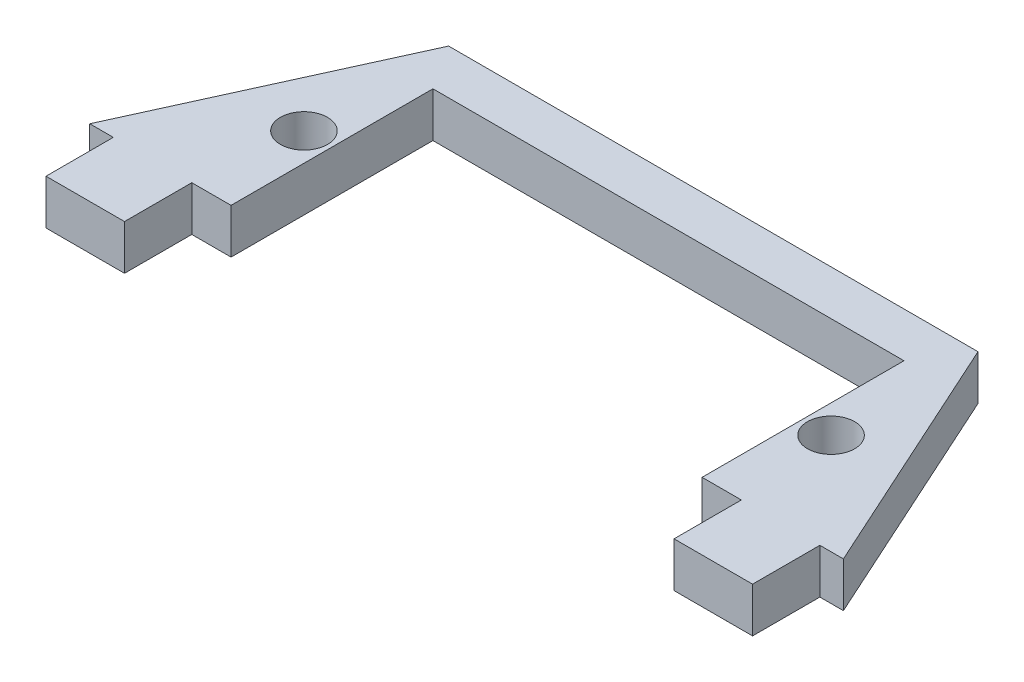
ISO-10303-21;
HEADER;
FILE_DESCRIPTION(('STEP AP214'),'2;1');
FILE_NAME('part.step','',(''),(''),'','','');
FILE_SCHEMA(('AUTOMOTIVE_DESIGN { 1 0 10303 214 1 1 1 1 }'));
ENDSEC;
DATA;
#1=APPLICATION_CONTEXT('core data for automotive mechanical design processes');
#2=APPLICATION_PROTOCOL_DEFINITION('international standard','automotive_design',2000,#1);
#3=PRODUCT_CONTEXT('',#1,'mechanical');
#4=PRODUCT('Part','Part','',(#3));
#5=PRODUCT_RELATED_PRODUCT_CATEGORY('part','',(#4));
#6=PRODUCT_DEFINITION_FORMATION('','',#4);
#7=PRODUCT_DEFINITION_CONTEXT('part definition',#1,'design');
#8=PRODUCT_DEFINITION('design','',#6,#7);
#9=PRODUCT_DEFINITION_SHAPE('','',#8);
#10=(LENGTH_UNIT() NAMED_UNIT(*) SI_UNIT(.MILLI.,.METRE.));
#11=(NAMED_UNIT(*) PLANE_ANGLE_UNIT() SI_UNIT($,.RADIAN.));
#12=(NAMED_UNIT(*) SI_UNIT($,.STERADIAN.) SOLID_ANGLE_UNIT());
#13=UNCERTAINTY_MEASURE_WITH_UNIT(LENGTH_MEASURE(1.E-05),#10,'distance_accuracy_value','');
#14=(GEOMETRIC_REPRESENTATION_CONTEXT(3) GLOBAL_UNCERTAINTY_ASSIGNED_CONTEXT((#13)) GLOBAL_UNIT_ASSIGNED_CONTEXT((#10,
#11,#12)) REPRESENTATION_CONTEXT('',''));
#15=CARTESIAN_POINT('',(0.,0.,0.));
#16=DIRECTION('',(0.,0.,1.));
#17=DIRECTION('',(1.,0.,0.));
#18=AXIS2_PLACEMENT_3D('',#15,#16,#17);
#19=CARTESIAN_POINT('',(0.,2.,1.78664387251308E-12));
#20=DIRECTION('',(1.06388671114322E-13,0.,1.));
#21=DIRECTION('',(1.,0.,-1.06388671114322E-13));
#22=AXIS2_PLACEMENT_3D('',#19,#20,#21);
#23=PLANE('',#22);
#24=DIRECTION('',(-1.,0.,1.06388671114322E-13));
#25=VECTOR('',#24,1.);
#26=CARTESIAN_POINT('',(0.,0.,1.78664387251308E-12));
#27=LINE('',#26,#25);
#28=CARTESIAN_POINT('',(16.8,0.,0.));
#29=VERTEX_POINT('',#28);
#30=CARTESIAN_POINT('',(15.75,0.,1.11022302462516E-13));
#31=VERTEX_POINT('',#30);
#32=EDGE_CURVE('E181',#29,#31,#27,.T.);
#33=ORIENTED_EDGE('',*,*,#32,.F.);
#34=DIRECTION('',(0.,-1.,0.));
#35=VECTOR('',#34,1.);
#36=CARTESIAN_POINT('',(16.8,2.,0.));
#37=LINE('',#36,#35);
#38=CARTESIAN_POINT('',(16.8,2.,0.));
#39=VERTEX_POINT('',#38);
#40=EDGE_CURVE('E11',#39,#29,#37,.T.);
#41=ORIENTED_EDGE('',*,*,#40,.F.);
#42=DIRECTION('',(-1.,0.,1.06388671114322E-13));
#43=VECTOR('',#42,1.);
#44=CARTESIAN_POINT('',(0.,2.,1.78664387251308E-12));
#45=LINE('',#44,#43);
#46=CARTESIAN_POINT('',(15.75,2.,1.11022302462516E-13));
#47=VERTEX_POINT('',#46);
#48=EDGE_CURVE('E223',#39,#47,#45,.T.);
#49=ORIENTED_EDGE('',*,*,#48,.T.);
#50=DIRECTION('',(0.,-1.,0.));
#51=VECTOR('',#50,1.);
#52=CARTESIAN_POINT('',(15.75,2.,1.11022302462516E-13));
#53=LINE('',#52,#51);
#54=EDGE_CURVE('E50',#47,#31,#53,.T.);
#55=ORIENTED_EDGE('',*,*,#54,.T.);
#56=EDGE_LOOP('',(#33,#41,#49,#55));
#57=FACE_BOUND('',#56,.T.);
#58=ADVANCED_FACE('F34',(#57),#23,.T.);
#59=CARTESIAN_POINT('',(13.9232876712329,2.,-6.32876712328767));
#60=DIRECTION('',(0.910366477462605,0.,-0.413802944301184));
#61=DIRECTION('',(-0.413802944301184,0.,-0.910366477462605));
#62=AXIS2_PLACEMENT_3D('',#59,#60,#61);
#63=PLANE('',#62);
#64=DIRECTION('',(0.413802944301184,0.,0.910366477462605));
#65=VECTOR('',#64,1.);
#66=CARTESIAN_POINT('',(13.9232876712329,0.,-6.32876712328767));
#67=LINE('',#66,#65);
#68=CARTESIAN_POINT('',(11.8,0.,-11.));
#69=VERTEX_POINT('',#68);
#70=EDGE_CURVE('E183',#69,#29,#67,.T.);
#71=ORIENTED_EDGE('',*,*,#70,.F.);
#72=DIRECTION('',(0.,-1.,0.));
#73=VECTOR('',#72,1.);
#74=CARTESIAN_POINT('',(11.8,2.,-11.));
#75=LINE('',#74,#73);
#76=CARTESIAN_POINT('',(11.8,2.,-11.));
#77=VERTEX_POINT('',#76);
#78=EDGE_CURVE('E42',#77,#69,#75,.T.);
#79=ORIENTED_EDGE('',*,*,#78,.F.);
#80=DIRECTION('',(0.413802944301184,0.,0.910366477462605));
#81=VECTOR('',#80,1.);
#82=CARTESIAN_POINT('',(13.9232876712329,2.,-6.32876712328767));
#83=LINE('',#82,#81);
#84=EDGE_CURVE('E507',#77,#39,#83,.T.);
#85=ORIENTED_EDGE('',*,*,#84,.T.);
#86=ORIENTED_EDGE('',*,*,#40,.T.);
#87=EDGE_LOOP('',(#71,#79,#85,#86));
#88=FACE_BOUND('',#87,.T.);
#89=ADVANCED_FACE('F264',(#88),#63,.T.);
#90=CARTESIAN_POINT('',(0.,2.,-11.));
#91=DIRECTION('',(0.,0.,-1.));
#92=DIRECTION('',(-1.,0.,0.));
#93=AXIS2_PLACEMENT_3D('',#90,#91,#92);
#94=PLANE('',#93);
#95=DIRECTION('',(1.,0.,0.));
#96=VECTOR('',#95,1.);
#97=CARTESIAN_POINT('',(0.,0.,-11.));
#98=LINE('',#97,#96);
#99=CARTESIAN_POINT('',(-11.8,0.,-11.));
#100=VERTEX_POINT('',#99);
#101=EDGE_CURVE('E186',#100,#69,#98,.T.);
#102=ORIENTED_EDGE('',*,*,#101,.F.);
#103=DIRECTION('',(0.,-1.,0.));
#104=VECTOR('',#103,1.);
#105=CARTESIAN_POINT('',(-11.8,2.,-11.));
#106=LINE('',#105,#104);
#107=CARTESIAN_POINT('',(-11.8,2.,-11.));
#108=VERTEX_POINT('',#107);
#109=EDGE_CURVE('E253',#108,#100,#106,.T.);
#110=ORIENTED_EDGE('',*,*,#109,.F.);
#111=DIRECTION('',(1.,0.,0.));
#112=VECTOR('',#111,1.);
#113=CARTESIAN_POINT('',(0.,2.,-11.));
#114=LINE('',#113,#112);
#115=EDGE_CURVE('E260',#108,#77,#114,.T.);
#116=ORIENTED_EDGE('',*,*,#115,.T.);
#117=ORIENTED_EDGE('',*,*,#78,.T.);
#118=EDGE_LOOP('',(#102,#110,#116,#117));
#119=FACE_BOUND('',#118,.T.);
#120=ADVANCED_FACE('F258',(#119),#94,.T.);
#121=CARTESIAN_POINT('',(-13.9232876712329,2.,-6.32876712328767));
#122=DIRECTION('',(0.910366477462605,0.,0.413802944301184));
#123=DIRECTION('',(0.413802944301184,0.,-0.910366477462605));
#124=AXIS2_PLACEMENT_3D('',#121,#122,#123);
#125=PLANE('',#124);
#126=DIRECTION('',(-0.413802944301184,0.,0.910366477462605));
#127=VECTOR('',#126,1.);
#128=CARTESIAN_POINT('',(-13.9232876712329,0.,-6.32876712328767));
#129=LINE('',#128,#127);
#130=CARTESIAN_POINT('',(-16.8,0.,0.));
#131=VERTEX_POINT('',#130);
#132=EDGE_CURVE('E189',#100,#131,#129,.T.);
#133=ORIENTED_EDGE('',*,*,#132,.T.);
#134=DIRECTION('',(0.,-1.,0.));
#135=VECTOR('',#134,1.);
#136=CARTESIAN_POINT('',(-16.8,2.,0.));
#137=LINE('',#136,#135);
#138=CARTESIAN_POINT('',(-16.8,2.,0.));
#139=VERTEX_POINT('',#138);
#140=EDGE_CURVE('E250',#139,#131,#137,.T.);
#141=ORIENTED_EDGE('',*,*,#140,.F.);
#142=DIRECTION('',(-0.413802944301184,0.,0.910366477462605));
#143=VECTOR('',#142,1.);
#144=CARTESIAN_POINT('',(-13.9232876712329,2.,-6.32876712328767));
#145=LINE('',#144,#143);
#146=EDGE_CURVE('E282',#108,#139,#145,.T.);
#147=ORIENTED_EDGE('',*,*,#146,.F.);
#148=ORIENTED_EDGE('',*,*,#109,.T.);
#149=EDGE_LOOP('',(#133,#141,#147,#148));
#150=FACE_BOUND('',#149,.T.);
#151=ADVANCED_FACE('F273',(#150),#125,.F.);
#152=CARTESIAN_POINT('',(0.,2.,0.));
#153=DIRECTION('',(0.,0.,-1.));
#154=DIRECTION('',(-1.,0.,0.));
#155=AXIS2_PLACEMENT_3D('',#152,#153,#154);
#156=PLANE('',#155);
#157=DIRECTION('',(1.,0.,0.));
#158=VECTOR('',#157,1.);
#159=CARTESIAN_POINT('',(0.,0.,0.));
#160=LINE('',#159,#158);
#161=CARTESIAN_POINT('',(-15.75,0.,0.));
#162=VERTEX_POINT('',#161);
#163=EDGE_CURVE('E191',#131,#162,#160,.T.);
#164=ORIENTED_EDGE('',*,*,#163,.T.);
#165=DIRECTION('',(0.,-1.,0.));
#166=VECTOR('',#165,1.);
#167=CARTESIAN_POINT('',(-15.75,2.,0.));
#168=LINE('',#167,#166);
#169=CARTESIAN_POINT('',(-15.75,2.,0.));
#170=VERTEX_POINT('',#169);
#171=EDGE_CURVE('E247',#170,#162,#168,.T.);
#172=ORIENTED_EDGE('',*,*,#171,.F.);
#173=DIRECTION('',(1.,0.,0.));
#174=VECTOR('',#173,1.);
#175=CARTESIAN_POINT('',(0.,2.,0.));
#176=LINE('',#175,#174);
#177=EDGE_CURVE('E279',#139,#170,#176,.T.);
#178=ORIENTED_EDGE('',*,*,#177,.F.);
#179=ORIENTED_EDGE('',*,*,#140,.T.);
#180=EDGE_LOOP('',(#164,#172,#178,#179));
#181=FACE_BOUND('',#180,.T.);
#182=ADVANCED_FACE('F277',(#181),#156,.F.);
#183=CARTESIAN_POINT('',(-15.75,2.,0.));
#184=DIRECTION('',(1.,0.,0.));
#185=DIRECTION('',(0.,0.,-1.));
#186=AXIS2_PLACEMENT_3D('',#183,#184,#185);
#187=PLANE('',#186);
#188=DIRECTION('',(0.,0.,1.));
#189=VECTOR('',#188,1.);
#190=CARTESIAN_POINT('',(-15.75,0.,0.));
#191=LINE('',#190,#189);
#192=CARTESIAN_POINT('',(-15.75,0.,3.));
#193=VERTEX_POINT('',#192);
#194=EDGE_CURVE('E193',#162,#193,#191,.T.);
#195=ORIENTED_EDGE('',*,*,#194,.T.);
#196=DIRECTION('',(0.,-1.,0.));
#197=VECTOR('',#196,1.);
#198=CARTESIAN_POINT('',(-15.75,2.,3.));
#199=LINE('',#198,#197);
#200=CARTESIAN_POINT('',(-15.75,2.,3.));
#201=VERTEX_POINT('',#200);
#202=EDGE_CURVE('E244',#201,#193,#199,.T.);
#203=ORIENTED_EDGE('',*,*,#202,.F.);
#204=DIRECTION('',(0.,0.,1.));
#205=VECTOR('',#204,1.);
#206=CARTESIAN_POINT('',(-15.75,2.,0.));
#207=LINE('',#206,#205);
#208=EDGE_CURVE('E281',#170,#201,#207,.T.);
#209=ORIENTED_EDGE('',*,*,#208,.F.);
#210=ORIENTED_EDGE('',*,*,#171,.T.);
#211=EDGE_LOOP('',(#195,#203,#209,#210));
#212=FACE_BOUND('',#211,.T.);
#213=ADVANCED_FACE('F331',(#212),#187,.F.);
#214=CARTESIAN_POINT('',(0.,2.,3.));
#215=DIRECTION('',(0.,0.,-1.));
#216=DIRECTION('',(-1.,0.,0.));
#217=AXIS2_PLACEMENT_3D('',#214,#215,#216);
#218=PLANE('',#217);
#219=DIRECTION('',(1.,0.,0.));
#220=VECTOR('',#219,1.);
#221=CARTESIAN_POINT('',(0.,0.,3.));
#222=LINE('',#221,#220);
#223=CARTESIAN_POINT('',(-12.25,0.,3.));
#224=VERTEX_POINT('',#223);
#225=EDGE_CURVE('E195',#193,#224,#222,.T.);
#226=ORIENTED_EDGE('',*,*,#225,.T.);
#227=DIRECTION('',(0.,-1.,0.));
#228=VECTOR('',#227,1.);
#229=CARTESIAN_POINT('',(-12.25,2.,3.));
#230=LINE('',#229,#228);
#231=CARTESIAN_POINT('',(-12.25,2.,3.));
#232=VERTEX_POINT('',#231);
#233=EDGE_CURVE('E241',#232,#224,#230,.T.);
#234=ORIENTED_EDGE('',*,*,#233,.F.);
#235=DIRECTION('',(1.,0.,0.));
#236=VECTOR('',#235,1.);
#237=CARTESIAN_POINT('',(0.,2.,3.));
#238=LINE('',#237,#236);
#239=EDGE_CURVE('E284',#201,#232,#238,.T.);
#240=ORIENTED_EDGE('',*,*,#239,.F.);
#241=ORIENTED_EDGE('',*,*,#202,.T.);
#242=EDGE_LOOP('',(#226,#234,#240,#241));
#243=FACE_BOUND('',#242,.T.);
#244=ADVANCED_FACE('F334',(#243),#218,.F.);
#245=CARTESIAN_POINT('',(-12.25,2.,0.));
#246=DIRECTION('',(-1.,0.,0.));
#247=DIRECTION('',(0.,0.,1.));
#248=AXIS2_PLACEMENT_3D('',#245,#246,#247);
#249=PLANE('',#248);
#250=DIRECTION('',(0.,0.,-1.));
#251=VECTOR('',#250,1.);
#252=CARTESIAN_POINT('',(-12.25,0.,0.));
#253=LINE('',#252,#251);
#254=CARTESIAN_POINT('',(-12.25,0.,0.));
#255=VERTEX_POINT('',#254);
#256=EDGE_CURVE('E197',#224,#255,#253,.T.);
#257=ORIENTED_EDGE('',*,*,#256,.T.);
#258=DIRECTION('',(0.,-1.,0.));
#259=VECTOR('',#258,1.);
#260=CARTESIAN_POINT('',(-12.25,2.,0.));
#261=LINE('',#260,#259);
#262=CARTESIAN_POINT('',(-12.25,2.,0.));
#263=VERTEX_POINT('',#262);
#264=EDGE_CURVE('E238',#263,#255,#261,.T.);
#265=ORIENTED_EDGE('',*,*,#264,.F.);
#266=DIRECTION('',(0.,0.,-1.));
#267=VECTOR('',#266,1.);
#268=CARTESIAN_POINT('',(-12.25,2.,0.));
#269=LINE('',#268,#267);
#270=EDGE_CURVE('E290',#232,#263,#269,.T.);
#271=ORIENTED_EDGE('',*,*,#270,.F.);
#272=ORIENTED_EDGE('',*,*,#233,.T.);
#273=EDGE_LOOP('',(#257,#265,#271,#272));
#274=FACE_BOUND('',#273,.T.);
#275=ADVANCED_FACE('F338',(#274),#249,.F.);
#276=CARTESIAN_POINT('',(0.,2.,0.));
#277=DIRECTION('',(0.,0.,-1.));
#278=DIRECTION('',(-1.,0.,0.));
#279=AXIS2_PLACEMENT_3D('',#276,#277,#278);
#280=PLANE('',#279);
#281=DIRECTION('',(1.,0.,0.));
#282=VECTOR('',#281,1.);
#283=CARTESIAN_POINT('',(0.,0.,0.));
#284=LINE('',#283,#282);
#285=CARTESIAN_POINT('',(-10.5,0.,0.));
#286=VERTEX_POINT('',#285);
#287=EDGE_CURVE('E199',#255,#286,#284,.T.);
#288=ORIENTED_EDGE('',*,*,#287,.T.);
#289=DIRECTION('',(0.,-1.,0.));
#290=VECTOR('',#289,1.);
#291=CARTESIAN_POINT('',(-10.5,2.,0.));
#292=LINE('',#291,#290);
#293=CARTESIAN_POINT('',(-10.5,2.,0.));
#294=VERTEX_POINT('',#293);
#295=EDGE_CURVE('E235',#294,#286,#292,.T.);
#296=ORIENTED_EDGE('',*,*,#295,.F.);
#297=DIRECTION('',(1.,0.,0.));
#298=VECTOR('',#297,1.);
#299=CARTESIAN_POINT('',(0.,2.,0.));
#300=LINE('',#299,#298);
#301=EDGE_CURVE('E292',#263,#294,#300,.T.);
#302=ORIENTED_EDGE('',*,*,#301,.F.);
#303=ORIENTED_EDGE('',*,*,#264,.T.);
#304=EDGE_LOOP('',(#288,#296,#302,#303));
#305=FACE_BOUND('',#304,.T.);
#306=ADVANCED_FACE('F342',(#305),#280,.F.);
#307=CARTESIAN_POINT('',(-10.5,2.,0.));
#308=DIRECTION('',(-1.,0.,0.));
#309=DIRECTION('',(0.,0.,1.));
#310=AXIS2_PLACEMENT_3D('',#307,#308,#309);
#311=PLANE('',#310);
#312=DIRECTION('',(0.,0.,-1.));
#313=VECTOR('',#312,1.);
#314=CARTESIAN_POINT('',(-10.5,0.,0.));
#315=LINE('',#314,#313);
#316=CARTESIAN_POINT('',(-10.5,0.,-9.));
#317=VERTEX_POINT('',#316);
#318=EDGE_CURVE('E201',#286,#317,#315,.T.);
#319=ORIENTED_EDGE('',*,*,#318,.T.);
#320=DIRECTION('',(0.,-1.,0.));
#321=VECTOR('',#320,1.);
#322=CARTESIAN_POINT('',(-10.5,2.,-9.));
#323=LINE('',#322,#321);
#324=CARTESIAN_POINT('',(-10.5,2.,-9.));
#325=VERTEX_POINT('',#324);
#326=EDGE_CURVE('E232',#325,#317,#323,.T.);
#327=ORIENTED_EDGE('',*,*,#326,.F.);
#328=DIRECTION('',(0.,0.,-1.));
#329=VECTOR('',#328,1.);
#330=CARTESIAN_POINT('',(-10.5,2.,0.));
#331=LINE('',#330,#329);
#332=EDGE_CURVE('E294',#294,#325,#331,.T.);
#333=ORIENTED_EDGE('',*,*,#332,.F.);
#334=ORIENTED_EDGE('',*,*,#295,.T.);
#335=EDGE_LOOP('',(#319,#327,#333,#334));
#336=FACE_BOUND('',#335,.T.);
#337=ADVANCED_FACE('F346',(#336),#311,.F.);
#338=CARTESIAN_POINT('',(0.,2.,-9.));
#339=DIRECTION('',(0.,0.,-1.));
#340=DIRECTION('',(-1.,0.,0.));
#341=AXIS2_PLACEMENT_3D('',#338,#339,#340);
#342=PLANE('',#341);
#343=DIRECTION('',(1.,0.,0.));
#344=VECTOR('',#343,1.);
#345=CARTESIAN_POINT('',(0.,0.,-9.));
#346=LINE('',#345,#344);
#347=CARTESIAN_POINT('',(10.5,0.,-9.));
#348=VERTEX_POINT('',#347);
#349=EDGE_CURVE('E203',#317,#348,#346,.T.);
#350=ORIENTED_EDGE('',*,*,#349,.T.);
#351=DIRECTION('',(0.,-1.,0.));
#352=VECTOR('',#351,1.);
#353=CARTESIAN_POINT('',(10.5,2.,-9.));
#354=LINE('',#353,#352);
#355=CARTESIAN_POINT('',(10.5,2.,-9.));
#356=VERTEX_POINT('',#355);
#357=EDGE_CURVE('E229',#356,#348,#354,.T.);
#358=ORIENTED_EDGE('',*,*,#357,.F.);
#359=DIRECTION('',(1.,0.,0.));
#360=VECTOR('',#359,1.);
#361=CARTESIAN_POINT('',(0.,2.,-9.));
#362=LINE('',#361,#360);
#363=EDGE_CURVE('E296',#325,#356,#362,.T.);
#364=ORIENTED_EDGE('',*,*,#363,.F.);
#365=ORIENTED_EDGE('',*,*,#326,.T.);
#366=EDGE_LOOP('',(#350,#358,#364,#365));
#367=FACE_BOUND('',#366,.T.);
#368=ADVANCED_FACE('F350',(#367),#342,.F.);
#369=CARTESIAN_POINT('',(10.5,2.,0.));
#370=DIRECTION('',(1.,0.,0.));
#371=DIRECTION('',(0.,0.,-1.));
#372=AXIS2_PLACEMENT_3D('',#369,#370,#371);
#373=PLANE('',#372);
#374=DIRECTION('',(0.,0.,1.));
#375=VECTOR('',#374,1.);
#376=CARTESIAN_POINT('',(10.5,0.,0.));
#377=LINE('',#376,#375);
#378=CARTESIAN_POINT('',(10.5,0.,0.));
#379=VERTEX_POINT('',#378);
#380=EDGE_CURVE('E205',#348,#379,#377,.T.);
#381=ORIENTED_EDGE('',*,*,#380,.T.);
#382=DIRECTION('',(0.,-1.,0.));
#383=VECTOR('',#382,1.);
#384=CARTESIAN_POINT('',(10.5,2.,0.));
#385=LINE('',#384,#383);
#386=CARTESIAN_POINT('',(10.5,2.,0.));
#387=VERTEX_POINT('',#386);
#388=EDGE_CURVE('E227',#387,#379,#385,.T.);
#389=ORIENTED_EDGE('',*,*,#388,.F.);
#390=DIRECTION('',(0.,0.,1.));
#391=VECTOR('',#390,1.);
#392=CARTESIAN_POINT('',(10.5,2.,0.));
#393=LINE('',#392,#391);
#394=EDGE_CURVE('E298',#356,#387,#393,.T.);
#395=ORIENTED_EDGE('',*,*,#394,.F.);
#396=ORIENTED_EDGE('',*,*,#357,.T.);
#397=EDGE_LOOP('',(#381,#389,#395,#396));
#398=FACE_BOUND('',#397,.T.);
#399=ADVANCED_FACE('F354',(#398),#373,.F.);
#400=CARTESIAN_POINT('',(0.,2.,-6.66133814775095E-13));
#401=DIRECTION('',(0.,0.,1.));
#402=DIRECTION('',(1.,0.,0.));
#403=AXIS2_PLACEMENT_3D('',#400,#401,#402);
#404=PLANE('',#403);
#405=DIRECTION('',(-1.,0.,0.));
#406=VECTOR('',#405,1.);
#407=CARTESIAN_POINT('',(0.,0.,-6.66133814775095E-13));
#408=LINE('',#407,#406);
#409=CARTESIAN_POINT('',(12.25,0.,1.11022302462516E-13));
#410=VERTEX_POINT('',#409);
#411=EDGE_CURVE('E208',#410,#379,#408,.T.);
#412=ORIENTED_EDGE('',*,*,#411,.F.);
#413=DIRECTION('',(0.,-1.,0.));
#414=VECTOR('',#413,1.);
#415=CARTESIAN_POINT('',(12.25,2.,1.11022302462516E-13));
#416=LINE('',#415,#414);
#417=CARTESIAN_POINT('',(12.25,2.,1.11022302462516E-13));
#418=VERTEX_POINT('',#417);
#419=EDGE_CURVE('E157',#418,#410,#416,.T.);
#420=ORIENTED_EDGE('',*,*,#419,.F.);
#421=DIRECTION('',(-1.,0.,0.));
#422=VECTOR('',#421,1.);
#423=CARTESIAN_POINT('',(0.,2.,-6.66133814775095E-13));
#424=LINE('',#423,#422);
#425=EDGE_CURVE('E167',#418,#387,#424,.T.);
#426=ORIENTED_EDGE('',*,*,#425,.T.);
#427=ORIENTED_EDGE('',*,*,#388,.T.);
#428=EDGE_LOOP('',(#412,#420,#426,#427));
#429=FACE_BOUND('',#428,.T.);
#430=ADVANCED_FACE('F301',(#429),#404,.T.);
#431=CARTESIAN_POINT('',(12.25,2.,0.));
#432=DIRECTION('',(-1.,0.,0.));
#433=DIRECTION('',(0.,0.,1.));
#434=AXIS2_PLACEMENT_3D('',#431,#432,#433);
#435=PLANE('',#434);
#436=DIRECTION('',(0.,0.,-1.));
#437=VECTOR('',#436,1.);
#438=CARTESIAN_POINT('',(12.25,0.,0.));
#439=LINE('',#438,#437);
#440=CARTESIAN_POINT('',(12.25,0.,3.));
#441=VERTEX_POINT('',#440);
#442=EDGE_CURVE('E153',#441,#410,#439,.T.);
#443=ORIENTED_EDGE('',*,*,#442,.F.);
#444=DIRECTION('',(0.,-1.,0.));
#445=VECTOR('',#444,1.);
#446=CARTESIAN_POINT('',(12.25,2.,3.));
#447=LINE('',#446,#445);
#448=CARTESIAN_POINT('',(12.25,2.,3.));
#449=VERTEX_POINT('',#448);
#450=EDGE_CURVE('E148',#449,#441,#447,.T.);
#451=ORIENTED_EDGE('',*,*,#450,.F.);
#452=DIRECTION('',(0.,0.,-1.));
#453=VECTOR('',#452,1.);
#454=CARTESIAN_POINT('',(12.25,2.,0.));
#455=LINE('',#454,#453);
#456=EDGE_CURVE('E151',#449,#418,#455,.T.);
#457=ORIENTED_EDGE('',*,*,#456,.T.);
#458=ORIENTED_EDGE('',*,*,#419,.T.);
#459=EDGE_LOOP('',(#443,#451,#457,#458));
#460=FACE_BOUND('',#459,.T.);
#461=ADVANCED_FACE('F150',(#460),#435,.T.);
#462=CARTESIAN_POINT('',(0.,2.,3.));
#463=DIRECTION('',(0.,0.,1.));
#464=DIRECTION('',(1.,0.,0.));
#465=AXIS2_PLACEMENT_3D('',#462,#463,#464);
#466=PLANE('',#465);
#467=DIRECTION('',(-1.,0.,0.));
#468=VECTOR('',#467,1.);
#469=CARTESIAN_POINT('',(0.,0.,3.));
#470=LINE('',#469,#468);
#471=CARTESIAN_POINT('',(15.75,0.,3.));
#472=VERTEX_POINT('',#471);
#473=EDGE_CURVE('E212',#472,#441,#470,.T.);
#474=ORIENTED_EDGE('',*,*,#473,.F.);
#475=DIRECTION('',(0.,-1.,0.));
#476=VECTOR('',#475,1.);
#477=CARTESIAN_POINT('',(15.75,2.,3.));
#478=LINE('',#477,#476);
#479=CARTESIAN_POINT('',(15.75,2.,3.));
#480=VERTEX_POINT('',#479);
#481=EDGE_CURVE('E99',#480,#472,#478,.T.);
#482=ORIENTED_EDGE('',*,*,#481,.F.);
#483=DIRECTION('',(-1.,0.,0.));
#484=VECTOR('',#483,1.);
#485=CARTESIAN_POINT('',(0.,2.,3.));
#486=LINE('',#485,#484);
#487=EDGE_CURVE('E165',#480,#449,#486,.T.);
#488=ORIENTED_EDGE('',*,*,#487,.T.);
#489=ORIENTED_EDGE('',*,*,#450,.T.);
#490=EDGE_LOOP('',(#474,#482,#488,#489));
#491=FACE_BOUND('',#490,.T.);
#492=ADVANCED_FACE('F169',(#491),#466,.T.);
#493=CARTESIAN_POINT('',(-11.75,2.,-4.5));
#494=DIRECTION('',(0.,-1.,0.));
#495=DIRECTION('',(0.,0.,-1.));
#496=AXIS2_PLACEMENT_3D('',#493,#494,#495);
#497=CYLINDRICAL_SURFACE('',#496,1.05);
#498=CARTESIAN_POINT('',(-11.75,2.,-4.5));
#499=DIRECTION('',(0.,1.,0.));
#500=DIRECTION('',(0.,0.,1.));
#501=AXIS2_PLACEMENT_3D('',#498,#499,#500);
#502=CIRCLE('',#501,1.05);
#503=CARTESIAN_POINT('',(-11.75,2.,-3.45));
#504=VERTEX_POINT('',#503);
#505=EDGE_CURVE('E172',#504,#504,#502,.T.);
#506=ORIENTED_EDGE('',*,*,#505,.T.);
#507=EDGE_LOOP('',(#506));
#508=FACE_BOUND('',#507,.T.);
#509=CARTESIAN_POINT('',(-11.75,0.,-4.5));
#510=DIRECTION('',(0.,1.,0.));
#511=DIRECTION('',(0.,0.,1.));
#512=AXIS2_PLACEMENT_3D('',#509,#510,#511);
#513=CIRCLE('',#512,1.05);
#514=CARTESIAN_POINT('',(-11.75,0.,-3.45));
#515=VERTEX_POINT('',#514);
#516=EDGE_CURVE('E217',#515,#515,#513,.T.);
#517=ORIENTED_EDGE('',*,*,#516,.F.);
#518=EDGE_LOOP('',(#517));
#519=FACE_BOUND('',#518,.T.);
#520=ADVANCED_FACE('F307',(#508,#519),#497,.F.);
#521=CARTESIAN_POINT('',(15.75,2.,0.));
#522=DIRECTION('',(1.,0.,0.));
#523=DIRECTION('',(0.,0.,-1.));
#524=AXIS2_PLACEMENT_3D('',#521,#522,#523);
#525=PLANE('',#524);
#526=DIRECTION('',(0.,0.,1.));
#527=VECTOR('',#526,1.);
#528=CARTESIAN_POINT('',(15.75,0.,0.));
#529=LINE('',#528,#527);
#530=EDGE_CURVE('E214',#31,#472,#529,.T.);
#531=ORIENTED_EDGE('',*,*,#530,.F.);
#532=ORIENTED_EDGE('',*,*,#54,.F.);
#533=DIRECTION('',(0.,0.,1.));
#534=VECTOR('',#533,1.);
#535=CARTESIAN_POINT('',(15.75,2.,0.));
#536=LINE('',#535,#534);
#537=EDGE_CURVE('E170',#47,#480,#536,.T.);
#538=ORIENTED_EDGE('',*,*,#537,.T.);
#539=ORIENTED_EDGE('',*,*,#481,.T.);
#540=EDGE_LOOP('',(#531,#532,#538,#539));
#541=FACE_BOUND('',#540,.T.);
#542=ADVANCED_FACE('F304',(#541),#525,.T.);
#543=CARTESIAN_POINT('',(11.75,2.,-4.5));
#544=DIRECTION('',(0.,-1.,0.));
#545=DIRECTION('',(0.,0.,-1.));
#546=AXIS2_PLACEMENT_3D('',#543,#544,#545);
#547=CYLINDRICAL_SURFACE('',#546,1.05);
#548=CARTESIAN_POINT('',(11.75,2.,-4.5));
#549=DIRECTION('',(0.,1.,0.));
#550=DIRECTION('',(0.,0.,1.));
#551=AXIS2_PLACEMENT_3D('',#548,#549,#550);
#552=CIRCLE('',#551,1.05);
#553=CARTESIAN_POINT('',(11.75,2.,-3.45));
#554=VERTEX_POINT('',#553);
#555=EDGE_CURVE('E178',#554,#554,#552,.F.);
#556=ORIENTED_EDGE('',*,*,#555,.F.);
#557=EDGE_LOOP('',(#556));
#558=FACE_BOUND('',#557,.T.);
#559=CARTESIAN_POINT('',(11.75,0.,-4.5));
#560=DIRECTION('',(0.,1.,0.));
#561=DIRECTION('',(0.,0.,1.));
#562=AXIS2_PLACEMENT_3D('',#559,#560,#561);
#563=CIRCLE('',#562,1.05);
#564=CARTESIAN_POINT('',(11.75,0.,-3.45));
#565=VERTEX_POINT('',#564);
#566=EDGE_CURVE('E220',#565,#565,#563,.F.);
#567=ORIENTED_EDGE('',*,*,#566,.T.);
#568=EDGE_LOOP('',(#567));
#569=FACE_BOUND('',#568,.T.);
#570=ADVANCED_FACE('F306',(#558,#569),#547,.F.);
#571=CARTESIAN_POINT('',(0.,2.,0.));
#572=DIRECTION('',(0.,1.,0.));
#573=DIRECTION('',(0.,0.,1.));
#574=AXIS2_PLACEMENT_3D('',#571,#572,#573);
#575=PLANE('',#574);
#576=ORIENTED_EDGE('',*,*,#48,.F.);
#577=ORIENTED_EDGE('',*,*,#84,.F.);
#578=ORIENTED_EDGE('',*,*,#115,.F.);
#579=ORIENTED_EDGE('',*,*,#146,.T.);
#580=ORIENTED_EDGE('',*,*,#177,.T.);
#581=ORIENTED_EDGE('',*,*,#208,.T.);
#582=ORIENTED_EDGE('',*,*,#239,.T.);
#583=ORIENTED_EDGE('',*,*,#270,.T.);
#584=ORIENTED_EDGE('',*,*,#301,.T.);
#585=ORIENTED_EDGE('',*,*,#332,.T.);
#586=ORIENTED_EDGE('',*,*,#363,.T.);
#587=ORIENTED_EDGE('',*,*,#394,.T.);
#588=ORIENTED_EDGE('',*,*,#425,.F.);
#589=ORIENTED_EDGE('',*,*,#456,.F.);
#590=ORIENTED_EDGE('',*,*,#487,.F.);
#591=ORIENTED_EDGE('',*,*,#537,.F.);
#592=EDGE_LOOP('',(#576,#577,#578,#579,#580,#581,#582,#583,#584,#585,#586,#587,#588,#589,#590,#591));
#593=FACE_BOUND('',#592,.T.);
#594=ORIENTED_EDGE('',*,*,#505,.F.);
#595=EDGE_LOOP('',(#594));
#596=FACE_BOUND('',#595,.T.);
#597=ORIENTED_EDGE('',*,*,#555,.T.);
#598=EDGE_LOOP('',(#597));
#599=FACE_BOUND('',#598,.T.);
#600=ADVANCED_FACE('F162',(#593,#596,#599),#575,.T.);
#601=CARTESIAN_POINT('',(0.,0.,0.));
#602=DIRECTION('',(0.,1.,0.));
#603=DIRECTION('',(0.,0.,1.));
#604=AXIS2_PLACEMENT_3D('',#601,#602,#603);
#605=PLANE('',#604);
#606=ORIENTED_EDGE('',*,*,#32,.T.);
#607=ORIENTED_EDGE('',*,*,#530,.T.);
#608=ORIENTED_EDGE('',*,*,#473,.T.);
#609=ORIENTED_EDGE('',*,*,#442,.T.);
#610=ORIENTED_EDGE('',*,*,#411,.T.);
#611=ORIENTED_EDGE('',*,*,#380,.F.);
#612=ORIENTED_EDGE('',*,*,#349,.F.);
#613=ORIENTED_EDGE('',*,*,#318,.F.);
#614=ORIENTED_EDGE('',*,*,#287,.F.);
#615=ORIENTED_EDGE('',*,*,#256,.F.);
#616=ORIENTED_EDGE('',*,*,#225,.F.);
#617=ORIENTED_EDGE('',*,*,#194,.F.);
#618=ORIENTED_EDGE('',*,*,#163,.F.);
#619=ORIENTED_EDGE('',*,*,#132,.F.);
#620=ORIENTED_EDGE('',*,*,#101,.T.);
#621=ORIENTED_EDGE('',*,*,#70,.T.);
#622=EDGE_LOOP('',(#606,#607,#608,#609,#610,#611,#612,#613,#614,#615,#616,#617,#618,#619,#620,#621));
#623=FACE_BOUND('',#622,.T.);
#624=ORIENTED_EDGE('',*,*,#516,.T.);
#625=EDGE_LOOP('',(#624));
#626=FACE_BOUND('',#625,.T.);
#627=ORIENTED_EDGE('',*,*,#566,.F.);
#628=EDGE_LOOP('',(#627));
#629=FACE_BOUND('',#628,.T.);
#630=ADVANCED_FACE('F267',(#623,#626,#629),#605,.F.);
#631=CLOSED_SHELL('',(#58,#89,#120,#151,#182,#213,#244,#275,#306,#337,#368,#399,#430,#461,#492,
#520,#542,#570,#600,#630));
#632=MANIFOLD_SOLID_BREP('B2',#631);
#633=ADVANCED_BREP_SHAPE_REPRESENTATION('',(#18,#632),#14);
#634=SHAPE_DEFINITION_REPRESENTATION(#9,#633);
ENDSEC;
END-ISO-10303-21;
